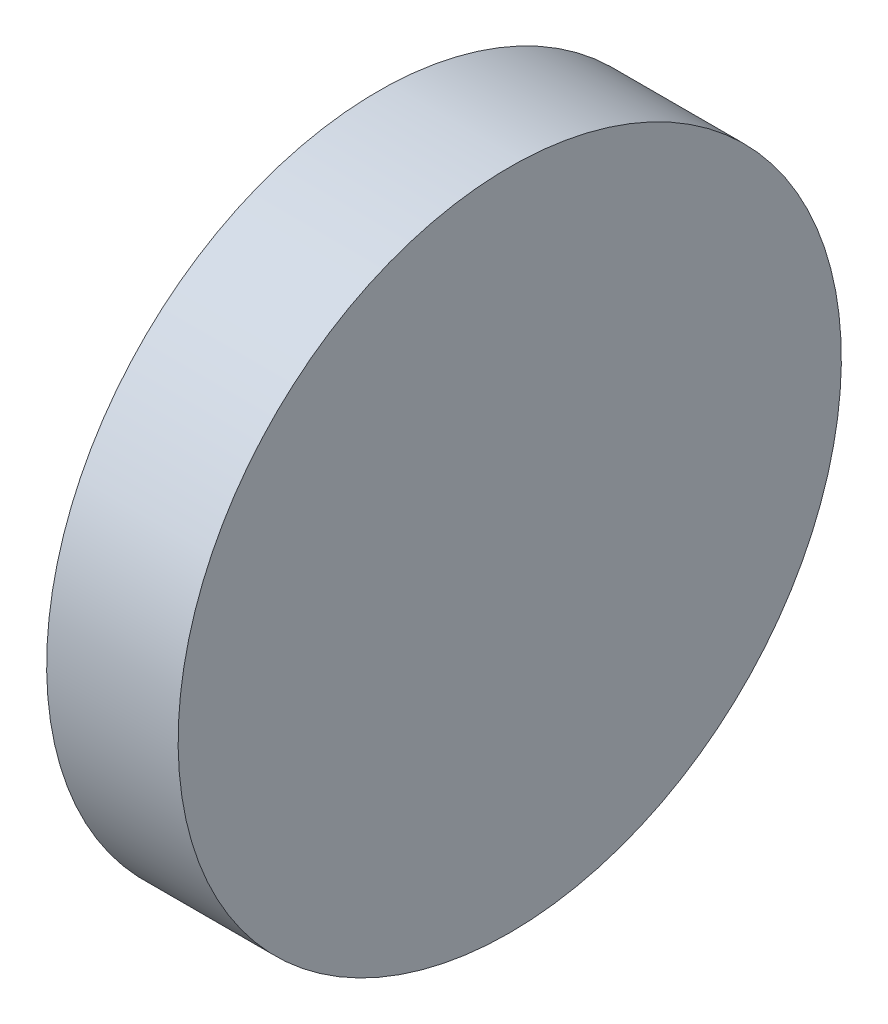
ISO-10303-21;
HEADER;
FILE_DESCRIPTION(('STEP AP214'),'2;1');
FILE_NAME('part.step','',(''),(''),'','','');
FILE_SCHEMA(('AUTOMOTIVE_DESIGN { 1 0 10303 214 1 1 1 1 }'));
ENDSEC;
DATA;
#1=APPLICATION_CONTEXT('core data for automotive mechanical design processes');
#2=APPLICATION_PROTOCOL_DEFINITION('international standard','automotive_design',2000,#1);
#3=PRODUCT_CONTEXT('',#1,'mechanical');
#4=PRODUCT('Part','Part','',(#3));
#5=PRODUCT_RELATED_PRODUCT_CATEGORY('part','',(#4));
#6=PRODUCT_DEFINITION_FORMATION('','',#4);
#7=PRODUCT_DEFINITION_CONTEXT('part definition',#1,'design');
#8=PRODUCT_DEFINITION('design','',#6,#7);
#9=PRODUCT_DEFINITION_SHAPE('','',#8);
#10=(LENGTH_UNIT() NAMED_UNIT(*) SI_UNIT(.MILLI.,.METRE.));
#11=(NAMED_UNIT(*) PLANE_ANGLE_UNIT() SI_UNIT($,.RADIAN.));
#12=(NAMED_UNIT(*) SI_UNIT($,.STERADIAN.) SOLID_ANGLE_UNIT());
#13=UNCERTAINTY_MEASURE_WITH_UNIT(LENGTH_MEASURE(1.E-05),#10,'distance_accuracy_value','');
#14=(GEOMETRIC_REPRESENTATION_CONTEXT(3) GLOBAL_UNCERTAINTY_ASSIGNED_CONTEXT((#13)) GLOBAL_UNIT_ASSIGNED_CONTEXT((#10,
#11,#12)) REPRESENTATION_CONTEXT('',''));
#15=CARTESIAN_POINT('',(0.,0.,0.));
#16=DIRECTION('',(0.,0.,1.));
#17=DIRECTION('',(1.,0.,0.));
#18=AXIS2_PLACEMENT_3D('',#15,#16,#17);
#19=CARTESIAN_POINT('',(-0.785000000000001,3.96,0.));
#20=DIRECTION('',(1.,0.,0.));
#21=DIRECTION('',(0.,1.,0.));
#22=AXIS2_PLACEMENT_3D('',#19,#20,#21);
#23=PLANE('',#22);
#24=CARTESIAN_POINT('',(-0.785,0.,0.));
#25=DIRECTION('',(-1.,0.,0.));
#26=DIRECTION('',(0.,-1.,0.));
#27=AXIS2_PLACEMENT_3D('',#24,#25,#26);
#28=CIRCLE('',#27,3.96);
#29=CARTESIAN_POINT('',(-0.784999999999999,-3.96,0.));
#30=VERTEX_POINT('',#29);
#31=EDGE_CURVE('E40',#30,#30,#28,.T.);
#32=ORIENTED_EDGE('',*,*,#31,.T.);
#33=EDGE_LOOP('',(#32));
#34=FACE_BOUND('',#33,.T.);
#35=ADVANCED_FACE('F34',(#34),#23,.F.);
#36=CARTESIAN_POINT('',(0.784999999999999,3.96,0.));
#37=DIRECTION('',(-1.,0.,0.));
#38=DIRECTION('',(0.,-1.,0.));
#39=AXIS2_PLACEMENT_3D('',#36,#37,#38);
#40=PLANE('',#39);
#41=CARTESIAN_POINT('',(0.785,0.,0.));
#42=DIRECTION('',(-1.,0.,0.));
#43=DIRECTION('',(0.,-1.,0.));
#44=AXIS2_PLACEMENT_3D('',#41,#42,#43);
#45=CIRCLE('',#44,3.96);
#46=CARTESIAN_POINT('',(0.785,-3.96,0.));
#47=VERTEX_POINT('',#46);
#48=EDGE_CURVE('E10',#47,#47,#45,.T.);
#49=ORIENTED_EDGE('',*,*,#48,.F.);
#50=EDGE_LOOP('',(#49));
#51=FACE_BOUND('',#50,.T.);
#52=ADVANCED_FACE('F49',(#51),#40,.F.);
#53=CARTESIAN_POINT('',(-0.785,0.,0.));
#54=DIRECTION('',(-1.,0.,0.));
#55=DIRECTION('',(0.,-1.,0.));
#56=AXIS2_PLACEMENT_3D('',#53,#54,#55);
#57=CYLINDRICAL_SURFACE('',#56,3.96);
#58=ORIENTED_EDGE('',*,*,#31,.F.);
#59=EDGE_LOOP('',(#58));
#60=FACE_BOUND('',#59,.T.);
#61=ORIENTED_EDGE('',*,*,#48,.T.);
#62=EDGE_LOOP('',(#61));
#63=FACE_BOUND('',#62,.T.);
#64=ADVANCED_FACE('F47',(#60,#63),#57,.T.);
#65=CLOSED_SHELL('',(#35,#52,#64));
#66=MANIFOLD_SOLID_BREP('B2',#65);
#67=ADVANCED_BREP_SHAPE_REPRESENTATION('',(#18,#66),#14);
#68=SHAPE_DEFINITION_REPRESENTATION(#9,#67);
ENDSEC;
END-ISO-10303-21;
